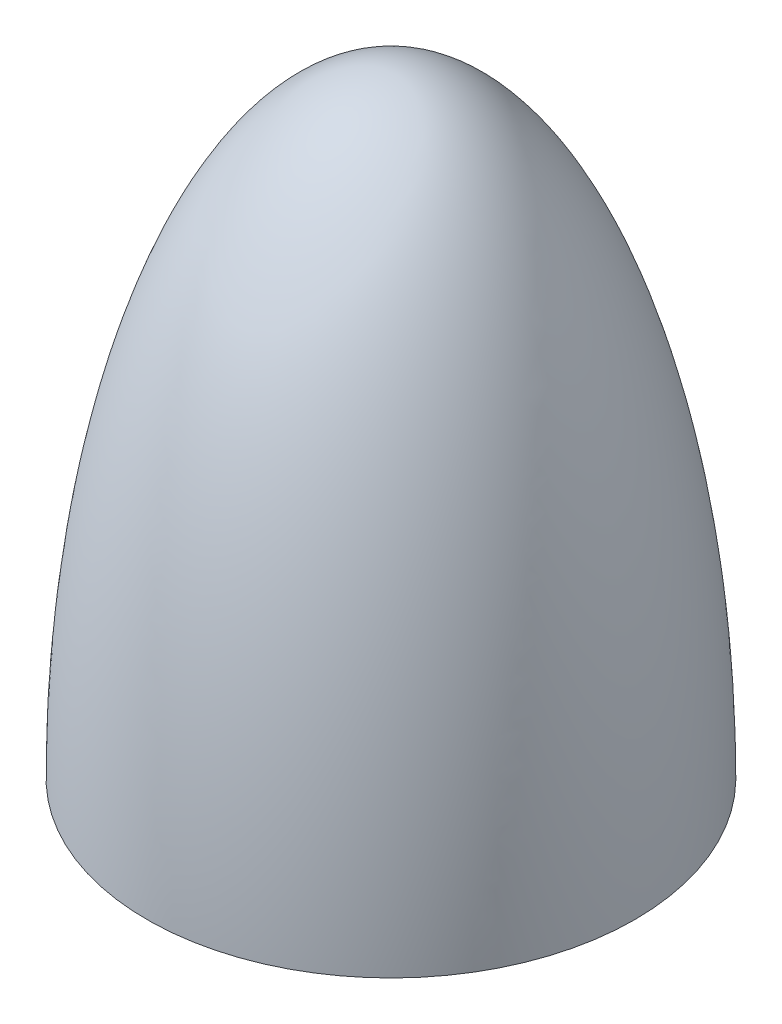
ISO-10303-21;
HEADER;
FILE_DESCRIPTION(('STEP AP214'),'2;1');
FILE_NAME('part.step','',(''),(''),'','','');
FILE_SCHEMA(('AUTOMOTIVE_DESIGN { 1 0 10303 214 1 1 1 1 }'));
ENDSEC;
DATA;
#1=APPLICATION_CONTEXT('core data for automotive mechanical design processes');
#2=APPLICATION_PROTOCOL_DEFINITION('international standard','automotive_design',2000,#1);
#3=PRODUCT_CONTEXT('',#1,'mechanical');
#4=PRODUCT('Part','Part','',(#3));
#5=PRODUCT_RELATED_PRODUCT_CATEGORY('part','',(#4));
#6=PRODUCT_DEFINITION_FORMATION('','',#4);
#7=PRODUCT_DEFINITION_CONTEXT('part definition',#1,'design');
#8=PRODUCT_DEFINITION('design','',#6,#7);
#9=PRODUCT_DEFINITION_SHAPE('','',#8);
#10=(LENGTH_UNIT() NAMED_UNIT(*) SI_UNIT(.MILLI.,.METRE.));
#11=(NAMED_UNIT(*) PLANE_ANGLE_UNIT() SI_UNIT($,.RADIAN.));
#12=(NAMED_UNIT(*) SI_UNIT($,.STERADIAN.) SOLID_ANGLE_UNIT());
#13=UNCERTAINTY_MEASURE_WITH_UNIT(LENGTH_MEASURE(1.E-05),#10,'distance_accuracy_value','');
#14=(GEOMETRIC_REPRESENTATION_CONTEXT(3) GLOBAL_UNCERTAINTY_ASSIGNED_CONTEXT((#13)) GLOBAL_UNIT_ASSIGNED_CONTEXT((#10,
#11,#12)) REPRESENTATION_CONTEXT('',''));
#15=CARTESIAN_POINT('',(0.,0.,0.));
#16=DIRECTION('',(0.,0.,1.));
#17=DIRECTION('',(1.,0.,0.));
#18=AXIS2_PLACEMENT_3D('',#15,#16,#17);
#19=CARTESIAN_POINT('',(0.,0.,0.));
#20=DIRECTION('',(0.,-1.,0.));
#21=DIRECTION('',(1.,0.,0.));
#22=AXIS2_PLACEMENT_3D('',#19,#20,#21);
#23=PLANE('',#22);
#24=CARTESIAN_POINT('',(0.,0.,0.));
#25=DIRECTION('',(0.,-1.,0.));
#26=DIRECTION('',(1.,0.,0.));
#27=AXIS2_PLACEMENT_3D('',#24,#25,#26);
#28=CIRCLE('',#27,56.4);
#29=CARTESIAN_POINT('',(56.4,0.,0.));
#30=VERTEX_POINT('',#29);
#31=EDGE_CURVE('E11',#30,#30,#28,.T.);
#32=ORIENTED_EDGE('',*,*,#31,.T.);
#33=EDGE_LOOP('',(#32));
#34=FACE_BOUND('',#33,.T.);
#35=CARTESIAN_POINT('',(0.,0.,0.));
#36=DIRECTION('',(0.,-1.,0.));
#37=DIRECTION('',(1.,0.,0.));
#38=AXIS2_PLACEMENT_3D('',#35,#36,#37);
#39=CIRCLE('',#38,55.2);
#40=CARTESIAN_POINT('',(55.2,0.,0.));
#41=VERTEX_POINT('',#40);
#42=EDGE_CURVE('E40',#41,#41,#39,.T.);
#43=ORIENTED_EDGE('',*,*,#42,.F.);
#44=EDGE_LOOP('',(#43));
#45=FACE_BOUND('',#44,.T.);
#46=ADVANCED_FACE('F33',(#34,#45),#23,.T.);
#47=CARTESIAN_POINT('',(56.4,0.,0.));
#48=CARTESIAN_POINT('',(56.4000000000195,18.3862557591306,0.));
#49=CARTESIAN_POINT('',(53.5172013388011,55.1587672773366,0.));
#50=CARTESIAN_POINT('',(43.2399944856855,94.1760710926875,0.));
#51=CARTESIAN_POINT('',(31.910527156266,117.756658921342,0.));
#52=CARTESIAN_POINT('',(22.156018554686,130.995707625531,0.));
#53=CARTESIAN_POINT('',(11.4252232201817,139.283492155786,0.));
#54=CARTESIAN_POINT('',(3.80840774005947,141.200000000244,0.));
#55=CARTESIAN_POINT('',(0.,141.200000000228,0.));
#56=B_SPLINE_CURVE_WITH_KNOTS('',3,(#47,#48,#49,#50,#51,#52,#53,#54,#55),.UNSPECIFIED.,.F.,.F.,
(4,1,1,1,1,1,4),(4.71238898038469,5.10508806208341,5.49778714378214,5.6941366846315,
5.89048622548086,6.08683576633022,6.28318530717959),.UNSPECIFIED.);
#57=CARTESIAN_POINT('',(0.,0.,0.));
#58=DIRECTION('',(0.,-1.,0.));
#59=AXIS1_PLACEMENT('',#57,#58);
#60=SURFACE_OF_REVOLUTION('',#56,#59);
#61=CARTESIAN_POINT('',(0.,141.200000000228,0.));
#62=VERTEX_POINT('',#61);
#63=VERTEX_LOOP('',#62);
#64=FACE_BOUND('',#63,.T.);
#65=ORIENTED_EDGE('',*,*,#31,.F.);
#66=EDGE_LOOP('',(#65));
#67=FACE_BOUND('',#66,.T.);
#68=ADVANCED_FACE('F46',(#64,#67),#60,.F.);
#69=CARTESIAN_POINT('',(0.,0.,0.));
#70=DIRECTION('',(0.,0.,1.));
#71=DIRECTION('',(0.,1.,0.));
#72=AXIS2_PLACEMENT_3D('',#69,#70,#71);
#73=ELLIPSE('',#72,140.,55.2);
#74=TRIMMED_CURVE('',#73,(PARAMETER_VALUE(3.14159265358979)),
(PARAMETER_VALUE(6.28318530717959)),.T.,.PARAMETER.);
#75=CARTESIAN_POINT('',(0.,0.,0.));
#76=DIRECTION('',(0.,-1.,0.));
#77=AXIS1_PLACEMENT('',#75,#76);
#78=SURFACE_OF_REVOLUTION('',#74,#77);
#79=CARTESIAN_POINT('',(0.,140.,0.));
#80=VERTEX_POINT('',#79);
#81=VERTEX_LOOP('',#80);
#82=FACE_BOUND('',#81,.T.);
#83=ORIENTED_EDGE('',*,*,#42,.T.);
#84=EDGE_LOOP('',(#83));
#85=FACE_BOUND('',#84,.T.);
#86=ADVANCED_FACE('F49',(#82,#85),#78,.T.);
#87=CLOSED_SHELL('',(#46,#68,#86));
#88=MANIFOLD_SOLID_BREP('B2',#87);
#89=ADVANCED_BREP_SHAPE_REPRESENTATION('',(#18,#88),#14);
#90=SHAPE_DEFINITION_REPRESENTATION(#9,#89);
ENDSEC;
END-ISO-10303-21;
